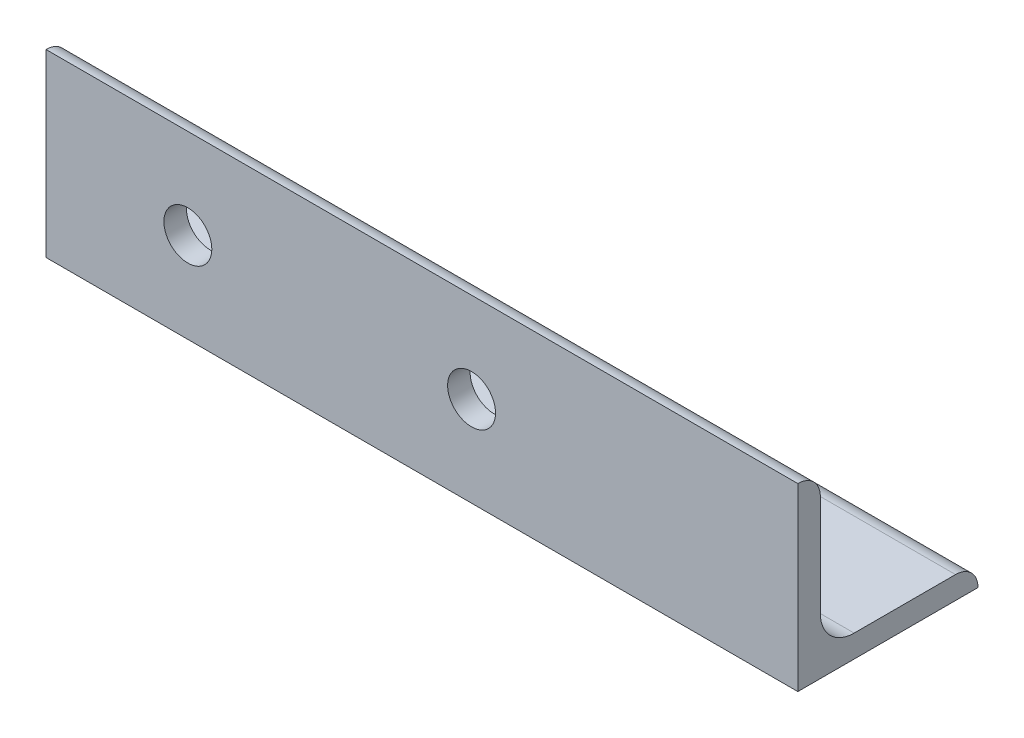
ISO-10303-21;
HEADER;
FILE_DESCRIPTION(('STEP AP214'),'2;1');
FILE_NAME('part.step','',(''),(''),'','','');
FILE_SCHEMA(('AUTOMOTIVE_DESIGN { 1 0 10303 214 1 1 1 1 }'));
ENDSEC;
DATA;
#1=APPLICATION_CONTEXT('core data for automotive mechanical design processes');
#2=APPLICATION_PROTOCOL_DEFINITION('international standard','automotive_design',2000,#1);
#3=PRODUCT_CONTEXT('',#1,'mechanical');
#4=PRODUCT('Part','Part','',(#3));
#5=PRODUCT_RELATED_PRODUCT_CATEGORY('part','',(#4));
#6=PRODUCT_DEFINITION_FORMATION('','',#4);
#7=PRODUCT_DEFINITION_CONTEXT('part definition',#1,'design');
#8=PRODUCT_DEFINITION('design','',#6,#7);
#9=PRODUCT_DEFINITION_SHAPE('','',#8);
#10=(LENGTH_UNIT() NAMED_UNIT(*) SI_UNIT(.MILLI.,.METRE.));
#11=(NAMED_UNIT(*) PLANE_ANGLE_UNIT() SI_UNIT($,.RADIAN.));
#12=(NAMED_UNIT(*) SI_UNIT($,.STERADIAN.) SOLID_ANGLE_UNIT());
#13=UNCERTAINTY_MEASURE_WITH_UNIT(LENGTH_MEASURE(1.E-05),#10,'distance_accuracy_value','');
#14=(GEOMETRIC_REPRESENTATION_CONTEXT(3) GLOBAL_UNCERTAINTY_ASSIGNED_CONTEXT((#13)) GLOBAL_UNIT_ASSIGNED_CONTEXT((#10,
#11,#12)) REPRESENTATION_CONTEXT('',''));
#15=CARTESIAN_POINT('',(0.,0.,0.));
#16=DIRECTION('',(0.,0.,1.));
#17=DIRECTION('',(1.,0.,0.));
#18=AXIS2_PLACEMENT_3D('',#15,#16,#17);
#19=CARTESIAN_POINT('',(10.7751908142057,0.,0.));
#20=DIRECTION('',(0.,0.,-1.));
#21=DIRECTION('',(-1.,0.,0.));
#22=AXIS2_PLACEMENT_3D('',#19,#20,#21);
#23=PLANE('',#22);
#24=CARTESIAN_POINT('',(-35.2248091857943,12.7,0.));
#25=DIRECTION('',(0.,0.,1.));
#26=DIRECTION('',(1.,0.,0.));
#27=AXIS2_PLACEMENT_3D('',#24,#25,#26);
#28=CIRCLE('',#27,3.3782);
#29=CARTESIAN_POINT('',(-31.8466091857943,12.7,0.));
#30=VERTEX_POINT('',#29);
#31=EDGE_CURVE('E237',#30,#30,#28,.T.);
#32=ORIENTED_EDGE('',*,*,#31,.F.);
#33=EDGE_LOOP('',(#32));
#34=FACE_BOUND('',#33,.T.);
#35=DIRECTION('',(0.,-1.,0.));
#36=VECTOR('',#35,1.);
#37=CARTESIAN_POINT('',(-95.2248091857943,0.,0.));
#38=LINE('',#37,#36);
#39=CARTESIAN_POINT('',(-95.2248091857943,25.4,0.));
#40=VERTEX_POINT('',#39);
#41=CARTESIAN_POINT('',(-95.2248091857943,0.,0.));
#42=VERTEX_POINT('',#41);
#43=EDGE_CURVE('E123',#40,#42,#38,.T.);
#44=ORIENTED_EDGE('',*,*,#43,.T.);
#45=DIRECTION('',(-1.,0.,0.));
#46=VECTOR('',#45,1.);
#47=CARTESIAN_POINT('',(10.7751908142057,0.,0.));
#48=LINE('',#47,#46);
#49=CARTESIAN_POINT('',(10.7751908142057,0.,0.));
#50=VERTEX_POINT('',#49);
#51=EDGE_CURVE('E167',#50,#42,#48,.T.);
#52=ORIENTED_EDGE('',*,*,#51,.F.);
#53=DIRECTION('',(0.,-1.,0.));
#54=VECTOR('',#53,1.);
#55=CARTESIAN_POINT('',(10.7751908142057,0.,0.));
#56=LINE('',#55,#54);
#57=CARTESIAN_POINT('',(10.7751908142057,25.4,0.));
#58=VERTEX_POINT('',#57);
#59=EDGE_CURVE('E85',#58,#50,#56,.T.);
#60=ORIENTED_EDGE('',*,*,#59,.F.);
#61=DIRECTION('',(-1.,0.,0.));
#62=VECTOR('',#61,1.);
#63=CARTESIAN_POINT('',(10.7751908142057,25.4,0.));
#64=LINE('',#63,#62);
#65=EDGE_CURVE('E163',#58,#40,#64,.T.);
#66=ORIENTED_EDGE('',*,*,#65,.T.);
#67=EDGE_LOOP('',(#44,#52,#60,#66));
#68=FACE_BOUND('',#67,.T.);
#69=CARTESIAN_POINT('',(-75.2248091857943,12.7,0.));
#70=DIRECTION('',(0.,0.,1.));
#71=DIRECTION('',(1.,0.,0.));
#72=AXIS2_PLACEMENT_3D('',#69,#70,#71);
#73=CIRCLE('',#72,3.3782);
#74=CARTESIAN_POINT('',(-71.8466091857943,12.7,0.));
#75=VERTEX_POINT('',#74);
#76=EDGE_CURVE('E231',#75,#75,#73,.T.);
#77=ORIENTED_EDGE('',*,*,#76,.F.);
#78=EDGE_LOOP('',(#77));
#79=FACE_BOUND('',#78,.T.);
#80=ADVANCED_FACE('F68',(#34,#68,#79),#23,.F.);
#81=CARTESIAN_POINT('',(10.7751908142057,0.,-25.4));
#82=DIRECTION('',(0.,1.,0.));
#83=DIRECTION('',(0.,0.,1.));
#84=AXIS2_PLACEMENT_3D('',#81,#82,#83);
#85=PLANE('',#84);
#86=DIRECTION('',(0.,0.,-1.));
#87=VECTOR('',#86,1.);
#88=CARTESIAN_POINT('',(-95.2248091857943,0.,-25.4));
#89=LINE('',#88,#87);
#90=CARTESIAN_POINT('',(-95.2248091857943,0.,-25.4));
#91=VERTEX_POINT('',#90);
#92=EDGE_CURVE('E171',#42,#91,#89,.T.);
#93=ORIENTED_EDGE('',*,*,#92,.T.);
#94=DIRECTION('',(-1.,0.,0.));
#95=VECTOR('',#94,1.);
#96=CARTESIAN_POINT('',(10.7751908142057,0.,-25.4));
#97=LINE('',#96,#95);
#98=CARTESIAN_POINT('',(10.7751908142057,0.,-25.4));
#99=VERTEX_POINT('',#98);
#100=EDGE_CURVE('E13',#99,#91,#97,.T.);
#101=ORIENTED_EDGE('',*,*,#100,.F.);
#102=DIRECTION('',(0.,0.,-1.));
#103=VECTOR('',#102,1.);
#104=CARTESIAN_POINT('',(10.7751908142057,0.,-25.4));
#105=LINE('',#104,#103);
#106=EDGE_CURVE('E188',#50,#99,#105,.T.);
#107=ORIENTED_EDGE('',*,*,#106,.F.);
#108=ORIENTED_EDGE('',*,*,#51,.T.);
#109=EDGE_LOOP('',(#93,#101,#107,#108));
#110=FACE_BOUND('',#109,.T.);
#111=ADVANCED_FACE('F70',(#110),#85,.F.);
#112=CARTESIAN_POINT('',(10.7751908142057,0.00508,-25.4));
#113=DIRECTION('',(0.,0.,1.));
#114=DIRECTION('',(1.,0.,0.));
#115=AXIS2_PLACEMENT_3D('',#112,#113,#114);
#116=PLANE('',#115);
#117=DIRECTION('',(0.,1.,0.));
#118=VECTOR('',#117,1.);
#119=CARTESIAN_POINT('',(-95.2248091857943,0.00508,-25.4));
#120=LINE('',#119,#118);
#121=CARTESIAN_POINT('',(-95.2248091857943,0.00508,-25.4));
#122=VERTEX_POINT('',#121);
#123=EDGE_CURVE('E174',#91,#122,#120,.T.);
#124=ORIENTED_EDGE('',*,*,#123,.T.);
#125=DIRECTION('',(-1.,0.,0.));
#126=VECTOR('',#125,1.);
#127=CARTESIAN_POINT('',(10.7751908142057,0.00508,-25.4));
#128=LINE('',#127,#126);
#129=CARTESIAN_POINT('',(10.7751908142057,0.00508,-25.4));
#130=VERTEX_POINT('',#129);
#131=EDGE_CURVE('E77',#130,#122,#128,.T.);
#132=ORIENTED_EDGE('',*,*,#131,.F.);
#133=DIRECTION('',(0.,1.,0.));
#134=VECTOR('',#133,1.);
#135=CARTESIAN_POINT('',(10.7751908142057,0.00508,-25.4));
#136=LINE('',#135,#134);
#137=EDGE_CURVE('E131',#99,#130,#136,.T.);
#138=ORIENTED_EDGE('',*,*,#137,.F.);
#139=ORIENTED_EDGE('',*,*,#100,.T.);
#140=EDGE_LOOP('',(#124,#132,#138,#139));
#141=FACE_BOUND('',#140,.T.);
#142=ADVANCED_FACE('F276',(#141),#116,.F.);
#143=CARTESIAN_POINT('',(10.7751908142057,0.00507999999999961,-22.23008));
#144=DIRECTION('',(-1.,0.,0.));
#145=DIRECTION('',(0.,0.,1.));
#146=AXIS2_PLACEMENT_3D('',#143,#144,#145);
#147=CYLINDRICAL_SURFACE('',#146,3.16992);
#148=CARTESIAN_POINT('',(-95.2248091857943,0.00507999999999961,-22.23008));
#149=DIRECTION('',(1.,0.,0.));
#150=DIRECTION('',(0.,0.,-1.));
#151=AXIS2_PLACEMENT_3D('',#148,#149,#150);
#152=CIRCLE('',#151,3.16992);
#153=CARTESIAN_POINT('',(-95.2248091857943,3.17499999999999,-22.23008));
#154=VERTEX_POINT('',#153);
#155=EDGE_CURVE('E177',#122,#154,#152,.T.);
#156=ORIENTED_EDGE('',*,*,#155,.T.);
#157=DIRECTION('',(-1.,0.,0.));
#158=VECTOR('',#157,1.);
#159=CARTESIAN_POINT('',(10.7751908142057,3.17499999999999,-22.23008));
#160=LINE('',#159,#158);
#161=CARTESIAN_POINT('',(10.7751908142057,3.17499999999999,-22.23008));
#162=VERTEX_POINT('',#161);
#163=EDGE_CURVE('E198',#162,#154,#160,.T.);
#164=ORIENTED_EDGE('',*,*,#163,.F.);
#165=CARTESIAN_POINT('',(10.7751908142057,0.00507999999999961,-22.23008));
#166=DIRECTION('',(1.,0.,0.));
#167=DIRECTION('',(0.,0.,-1.));
#168=AXIS2_PLACEMENT_3D('',#165,#166,#167);
#169=CIRCLE('',#168,3.16992);
#170=EDGE_CURVE('E206',#130,#162,#169,.T.);
#171=ORIENTED_EDGE('',*,*,#170,.F.);
#172=ORIENTED_EDGE('',*,*,#131,.T.);
#173=EDGE_LOOP('',(#156,#164,#171,#172));
#174=FACE_BOUND('',#173,.T.);
#175=ADVANCED_FACE('F204',(#174),#147,.T.);
#176=CARTESIAN_POINT('',(10.7751908142057,3.17499999999999,-7.93750000000001));
#177=DIRECTION('',(0.,-1.,0.));
#178=DIRECTION('',(0.,0.,-1.));
#179=AXIS2_PLACEMENT_3D('',#176,#177,#178);
#180=PLANE('',#179);
#181=DIRECTION('',(0.,0.,1.));
#182=VECTOR('',#181,1.);
#183=CARTESIAN_POINT('',(-95.2248091857943,3.17499999999999,-7.93750000000001));
#184=LINE('',#183,#182);
#185=CARTESIAN_POINT('',(-95.2248091857943,3.17499999999999,-7.93750000000002));
#186=VERTEX_POINT('',#185);
#187=EDGE_CURVE('E179',#154,#186,#184,.T.);
#188=ORIENTED_EDGE('',*,*,#187,.T.);
#189=DIRECTION('',(-1.,0.,0.));
#190=VECTOR('',#189,1.);
#191=CARTESIAN_POINT('',(10.7751908142057,3.17499999999999,-7.93750000000002));
#192=LINE('',#191,#190);
#193=CARTESIAN_POINT('',(10.7751908142057,3.17499999999999,-7.93750000000002));
#194=VERTEX_POINT('',#193);
#195=EDGE_CURVE('E195',#194,#186,#192,.T.);
#196=ORIENTED_EDGE('',*,*,#195,.F.);
#197=DIRECTION('',(0.,0.,1.));
#198=VECTOR('',#197,1.);
#199=CARTESIAN_POINT('',(10.7751908142057,3.17499999999999,-7.93750000000001));
#200=LINE('',#199,#198);
#201=EDGE_CURVE('E222',#162,#194,#200,.T.);
#202=ORIENTED_EDGE('',*,*,#201,.F.);
#203=ORIENTED_EDGE('',*,*,#163,.T.);
#204=EDGE_LOOP('',(#188,#196,#202,#203));
#205=FACE_BOUND('',#204,.T.);
#206=ADVANCED_FACE('F215',(#205),#180,.F.);
#207=CARTESIAN_POINT('',(10.7751908142057,7.93749999999999,-7.93750000000001));
#208=DIRECTION('',(-1.,0.,0.));
#209=DIRECTION('',(0.,0.,1.));
#210=AXIS2_PLACEMENT_3D('',#207,#208,#209);
#211=CYLINDRICAL_SURFACE('',#210,4.7625);
#212=CARTESIAN_POINT('',(-95.2248091857943,7.93749999999999,-7.93750000000001));
#213=DIRECTION('',(-1.,0.,0.));
#214=DIRECTION('',(0.,0.,1.));
#215=AXIS2_PLACEMENT_3D('',#212,#213,#214);
#216=CIRCLE('',#215,4.7625);
#217=CARTESIAN_POINT('',(-95.2248091857943,7.93749999999999,-3.17500000000001));
#218=VERTEX_POINT('',#217);
#219=EDGE_CURVE('E181',#186,#218,#216,.T.);
#220=ORIENTED_EDGE('',*,*,#219,.T.);
#221=DIRECTION('',(-1.,0.,0.));
#222=VECTOR('',#221,1.);
#223=CARTESIAN_POINT('',(10.7751908142057,7.93749999999999,-3.17500000000001));
#224=LINE('',#223,#222);
#225=CARTESIAN_POINT('',(10.7751908142057,7.93749999999999,-3.17500000000001));
#226=VERTEX_POINT('',#225);
#227=EDGE_CURVE('E192',#226,#218,#224,.T.);
#228=ORIENTED_EDGE('',*,*,#227,.F.);
#229=CARTESIAN_POINT('',(10.7751908142057,7.93749999999999,-7.93750000000001));
#230=DIRECTION('',(-1.,0.,0.));
#231=DIRECTION('',(0.,0.,1.));
#232=AXIS2_PLACEMENT_3D('',#229,#230,#231);
#233=CIRCLE('',#232,4.7625);
#234=EDGE_CURVE('E221',#194,#226,#233,.T.);
#235=ORIENTED_EDGE('',*,*,#234,.F.);
#236=ORIENTED_EDGE('',*,*,#195,.T.);
#237=EDGE_LOOP('',(#220,#228,#235,#236));
#238=FACE_BOUND('',#237,.T.);
#239=ADVANCED_FACE('F219',(#238),#211,.F.);
#240=CARTESIAN_POINT('',(10.7751908142057,22.23008,-3.17499999999999));
#241=DIRECTION('',(0.,0.,1.));
#242=DIRECTION('',(0.,-1.,0.));
#243=AXIS2_PLACEMENT_3D('',#240,#241,#242);
#244=PLANE('',#243);
#245=CARTESIAN_POINT('',(-35.2248091857943,12.7,-3.17500000000001));
#246=DIRECTION('',(0.,0.,1.));
#247=DIRECTION('',(0.,-1.,0.));
#248=AXIS2_PLACEMENT_3D('',#245,#246,#247);
#249=CIRCLE('',#248,3.3782);
#250=CARTESIAN_POINT('',(-35.2248091857943,9.3218,-3.17500000000001));
#251=VERTEX_POINT('',#250);
#252=EDGE_CURVE('E234',#251,#251,#249,.T.);
#253=ORIENTED_EDGE('',*,*,#252,.T.);
#254=EDGE_LOOP('',(#253));
#255=FACE_BOUND('',#254,.T.);
#256=CARTESIAN_POINT('',(-75.2248091857943,12.7,-3.17500000000001));
#257=DIRECTION('',(0.,0.,1.));
#258=DIRECTION('',(0.,-1.,0.));
#259=AXIS2_PLACEMENT_3D('',#256,#257,#258);
#260=CIRCLE('',#259,3.3782);
#261=CARTESIAN_POINT('',(-75.2248091857943,9.32179999999999,-3.17500000000001));
#262=VERTEX_POINT('',#261);
#263=EDGE_CURVE('E175',#262,#262,#260,.T.);
#264=ORIENTED_EDGE('',*,*,#263,.T.);
#265=EDGE_LOOP('',(#264));
#266=FACE_BOUND('',#265,.T.);
#267=DIRECTION('',(0.,1.,0.));
#268=VECTOR('',#267,1.);
#269=CARTESIAN_POINT('',(-95.2248091857943,22.23008,-3.17499999999999));
#270=LINE('',#269,#268);
#271=CARTESIAN_POINT('',(-95.2248091857943,22.23008,-3.17499999999999));
#272=VERTEX_POINT('',#271);
#273=EDGE_CURVE('E183',#218,#272,#270,.T.);
#274=ORIENTED_EDGE('',*,*,#273,.T.);
#275=DIRECTION('',(-1.,0.,0.));
#276=VECTOR('',#275,1.);
#277=CARTESIAN_POINT('',(10.7751908142057,22.23008,-3.17499999999999));
#278=LINE('',#277,#276);
#279=CARTESIAN_POINT('',(10.7751908142057,22.23008,-3.17499999999999));
#280=VERTEX_POINT('',#279);
#281=EDGE_CURVE('E162',#280,#272,#278,.T.);
#282=ORIENTED_EDGE('',*,*,#281,.F.);
#283=DIRECTION('',(0.,1.,0.));
#284=VECTOR('',#283,1.);
#285=CARTESIAN_POINT('',(10.7751908142057,22.23008,-3.17499999999999));
#286=LINE('',#285,#284);
#287=EDGE_CURVE('E153',#226,#280,#286,.T.);
#288=ORIENTED_EDGE('',*,*,#287,.F.);
#289=ORIENTED_EDGE('',*,*,#227,.T.);
#290=EDGE_LOOP('',(#274,#282,#288,#289));
#291=FACE_BOUND('',#290,.T.);
#292=ADVANCED_FACE('F267',(#255,#266,#291),#244,.F.);
#293=CARTESIAN_POINT('',(10.7751908142057,22.23008,-0.00508000000000019));
#294=DIRECTION('',(-1.,0.,0.));
#295=DIRECTION('',(0.,0.,1.));
#296=AXIS2_PLACEMENT_3D('',#293,#294,#295);
#297=CYLINDRICAL_SURFACE('',#296,3.16991999999999);
#298=CARTESIAN_POINT('',(-95.2248091857943,22.23008,-0.00508000000000019));
#299=DIRECTION('',(1.,0.,0.));
#300=DIRECTION('',(0.,0.,1.));
#301=AXIS2_PLACEMENT_3D('',#298,#299,#300);
#302=CIRCLE('',#301,3.16991999999999);
#303=CARTESIAN_POINT('',(-95.2248091857943,25.4,-0.00508));
#304=VERTEX_POINT('',#303);
#305=EDGE_CURVE('E161',#272,#304,#302,.T.);
#306=ORIENTED_EDGE('',*,*,#305,.T.);
#307=DIRECTION('',(-1.,0.,0.));
#308=VECTOR('',#307,1.);
#309=CARTESIAN_POINT('',(10.7751908142057,25.4,-0.00508));
#310=LINE('',#309,#308);
#311=CARTESIAN_POINT('',(10.7751908142057,25.4,-0.00508));
#312=VERTEX_POINT('',#311);
#313=EDGE_CURVE('E158',#312,#304,#310,.T.);
#314=ORIENTED_EDGE('',*,*,#313,.F.);
#315=CARTESIAN_POINT('',(10.7751908142057,22.23008,-0.00508000000000019));
#316=DIRECTION('',(1.,0.,0.));
#317=DIRECTION('',(0.,0.,1.));
#318=AXIS2_PLACEMENT_3D('',#315,#316,#317);
#319=CIRCLE('',#318,3.16991999999999);
#320=EDGE_CURVE('E147',#280,#312,#319,.T.);
#321=ORIENTED_EDGE('',*,*,#320,.F.);
#322=ORIENTED_EDGE('',*,*,#281,.T.);
#323=EDGE_LOOP('',(#306,#314,#321,#322));
#324=FACE_BOUND('',#323,.T.);
#325=ADVANCED_FACE('F159',(#324),#297,.T.);
#326=CARTESIAN_POINT('',(10.7751908142057,25.4,0.));
#327=DIRECTION('',(0.,-1.,0.));
#328=DIRECTION('',(0.,0.,-1.));
#329=AXIS2_PLACEMENT_3D('',#326,#327,#328);
#330=PLANE('',#329);
#331=DIRECTION('',(0.,0.,1.));
#332=VECTOR('',#331,1.);
#333=CARTESIAN_POINT('',(-95.2248091857943,25.4,0.));
#334=LINE('',#333,#332);
#335=EDGE_CURVE('E117',#304,#40,#334,.T.);
#336=ORIENTED_EDGE('',*,*,#335,.T.);
#337=ORIENTED_EDGE('',*,*,#65,.F.);
#338=DIRECTION('',(0.,0.,1.));
#339=VECTOR('',#338,1.);
#340=CARTESIAN_POINT('',(10.7751908142057,25.4,0.));
#341=LINE('',#340,#339);
#342=EDGE_CURVE('E151',#312,#58,#341,.T.);
#343=ORIENTED_EDGE('',*,*,#342,.F.);
#344=ORIENTED_EDGE('',*,*,#313,.T.);
#345=EDGE_LOOP('',(#336,#337,#343,#344));
#346=FACE_BOUND('',#345,.T.);
#347=ADVANCED_FACE('F165',(#346),#330,.F.);
#348=CARTESIAN_POINT('',(10.7751908142057,22.23008,-0.00508000000000019));
#349=DIRECTION('',(-1.,0.,0.));
#350=DIRECTION('',(0.,0.,1.));
#351=AXIS2_PLACEMENT_3D('',#348,#349,#350);
#352=PLANE('',#351);
#353=ORIENTED_EDGE('',*,*,#106,.T.);
#354=ORIENTED_EDGE('',*,*,#137,.T.);
#355=ORIENTED_EDGE('',*,*,#170,.T.);
#356=ORIENTED_EDGE('',*,*,#201,.T.);
#357=ORIENTED_EDGE('',*,*,#234,.T.);
#358=ORIENTED_EDGE('',*,*,#287,.T.);
#359=ORIENTED_EDGE('',*,*,#320,.T.);
#360=ORIENTED_EDGE('',*,*,#342,.T.);
#361=ORIENTED_EDGE('',*,*,#59,.T.);
#362=EDGE_LOOP('',(#353,#354,#355,#356,#357,#358,#359,#360,#361));
#363=FACE_BOUND('',#362,.T.);
#364=ADVANCED_FACE('F149',(#363),#352,.F.);
#365=CARTESIAN_POINT('',(-95.2248091857943,22.23008,-0.00508000000000019));
#366=DIRECTION('',(-1.,0.,0.));
#367=DIRECTION('',(0.,0.,1.));
#368=AXIS2_PLACEMENT_3D('',#365,#366,#367);
#369=PLANE('',#368);
#370=ORIENTED_EDGE('',*,*,#92,.F.);
#371=ORIENTED_EDGE('',*,*,#43,.F.);
#372=ORIENTED_EDGE('',*,*,#335,.F.);
#373=ORIENTED_EDGE('',*,*,#305,.F.);
#374=ORIENTED_EDGE('',*,*,#273,.F.);
#375=ORIENTED_EDGE('',*,*,#219,.F.);
#376=ORIENTED_EDGE('',*,*,#187,.F.);
#377=ORIENTED_EDGE('',*,*,#155,.F.);
#378=ORIENTED_EDGE('',*,*,#123,.F.);
#379=EDGE_LOOP('',(#370,#371,#372,#373,#374,#375,#376,#377,#378));
#380=FACE_BOUND('',#379,.T.);
#381=ADVANCED_FACE('F210',(#380),#369,.T.);
#382=CARTESIAN_POINT('',(-75.2248091857943,12.7,0.));
#383=DIRECTION('',(0.,0.,1.));
#384=DIRECTION('',(1.,0.,0.));
#385=AXIS2_PLACEMENT_3D('',#382,#383,#384);
#386=CYLINDRICAL_SURFACE('',#385,3.3782);
#387=ORIENTED_EDGE('',*,*,#263,.F.);
#388=EDGE_LOOP('',(#387));
#389=FACE_BOUND('',#388,.T.);
#390=ORIENTED_EDGE('',*,*,#76,.T.);
#391=EDGE_LOOP('',(#390));
#392=FACE_BOUND('',#391,.T.);
#393=ADVANCED_FACE('F248',(#389,#392),#386,.F.);
#394=CARTESIAN_POINT('',(-35.2248091857943,12.7,0.));
#395=DIRECTION('',(0.,0.,1.));
#396=DIRECTION('',(1.,0.,0.));
#397=AXIS2_PLACEMENT_3D('',#394,#395,#396);
#398=CYLINDRICAL_SURFACE('',#397,3.3782);
#399=ORIENTED_EDGE('',*,*,#252,.F.);
#400=EDGE_LOOP('',(#399));
#401=FACE_BOUND('',#400,.T.);
#402=ORIENTED_EDGE('',*,*,#31,.T.);
#403=EDGE_LOOP('',(#402));
#404=FACE_BOUND('',#403,.T.);
#405=ADVANCED_FACE('F241',(#401,#404),#398,.F.);
#406=CLOSED_SHELL('',(#80,#111,#142,#175,#206,#239,#292,#325,#347,#364,#381,#393,#405));
#407=MANIFOLD_SOLID_BREP('B2',#406);
#408=ADVANCED_BREP_SHAPE_REPRESENTATION('',(#18,#407),#14);
#409=SHAPE_DEFINITION_REPRESENTATION(#9,#408);
ENDSEC;
END-ISO-10303-21;
